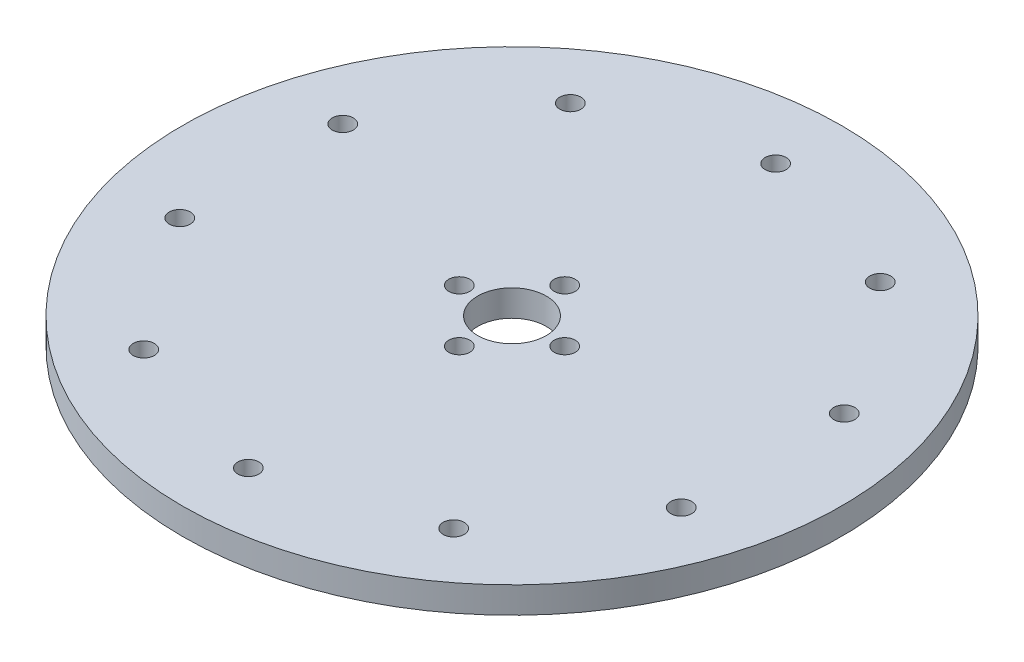
ISO-10303-21;
HEADER;
FILE_DESCRIPTION(('STEP AP214'),'2;1');
FILE_NAME('part.step','',(''),(''),'','','');
FILE_SCHEMA(('AUTOMOTIVE_DESIGN { 1 0 10303 214 1 1 1 1 }'));
ENDSEC;
DATA;
#1=APPLICATION_CONTEXT('core data for automotive mechanical design processes');
#2=APPLICATION_PROTOCOL_DEFINITION('international standard','automotive_design',2000,#1);
#3=PRODUCT_CONTEXT('',#1,'mechanical');
#4=PRODUCT('Part','Part','',(#3));
#5=PRODUCT_RELATED_PRODUCT_CATEGORY('part','',(#4));
#6=PRODUCT_DEFINITION_FORMATION('','',#4);
#7=PRODUCT_DEFINITION_CONTEXT('part definition',#1,'design');
#8=PRODUCT_DEFINITION('design','',#6,#7);
#9=PRODUCT_DEFINITION_SHAPE('','',#8);
#10=(LENGTH_UNIT() NAMED_UNIT(*) SI_UNIT(.MILLI.,.METRE.));
#11=(NAMED_UNIT(*) PLANE_ANGLE_UNIT() SI_UNIT($,.RADIAN.));
#12=(NAMED_UNIT(*) SI_UNIT($,.STERADIAN.) SOLID_ANGLE_UNIT());
#13=UNCERTAINTY_MEASURE_WITH_UNIT(LENGTH_MEASURE(1.E-05),#10,'distance_accuracy_value','');
#14=(GEOMETRIC_REPRESENTATION_CONTEXT(3) GLOBAL_UNCERTAINTY_ASSIGNED_CONTEXT((#13)) GLOBAL_UNIT_ASSIGNED_CONTEXT((#10,
#11,#12)) REPRESENTATION_CONTEXT('',''));
#15=CARTESIAN_POINT('',(0.,0.,0.));
#16=DIRECTION('',(0.,0.,1.));
#17=DIRECTION('',(1.,0.,0.));
#18=AXIS2_PLACEMENT_3D('',#15,#16,#17);
#19=CARTESIAN_POINT('',(0.,4.,0.));
#20=DIRECTION('',(0.,-1.,0.));
#21=DIRECTION('',(0.,0.,-1.));
#22=AXIS2_PLACEMENT_3D('',#19,#20,#21);
#23=CYLINDRICAL_SURFACE('',#22,50.);
#24=CARTESIAN_POINT('',(0.,4.,0.));
#25=DIRECTION('',(0.,1.,0.));
#26=DIRECTION('',(0.,0.,1.));
#27=AXIS2_PLACEMENT_3D('',#24,#25,#26);
#28=CIRCLE('',#27,50.);
#29=CARTESIAN_POINT('',(0.,4.,50.));
#30=VERTEX_POINT('',#29);
#31=EDGE_CURVE('E10',#30,#30,#28,.T.);
#32=ORIENTED_EDGE('',*,*,#31,.F.);
#33=EDGE_LOOP('',(#32));
#34=FACE_BOUND('',#33,.T.);
#35=CARTESIAN_POINT('',(0.,0.,0.));
#36=DIRECTION('',(0.,1.,0.));
#37=DIRECTION('',(0.,0.,1.));
#38=AXIS2_PLACEMENT_3D('',#35,#36,#37);
#39=CIRCLE('',#38,50.);
#40=CARTESIAN_POINT('',(0.,0.,50.));
#41=VERTEX_POINT('',#40);
#42=EDGE_CURVE('E42',#41,#41,#39,.T.);
#43=ORIENTED_EDGE('',*,*,#42,.T.);
#44=EDGE_LOOP('',(#43));
#45=FACE_BOUND('',#44,.T.);
#46=ADVANCED_FACE('F35',(#34,#45),#23,.T.);
#47=CARTESIAN_POINT('',(0.,4.,0.));
#48=DIRECTION('',(0.,1.,0.));
#49=DIRECTION('',(0.,0.,1.));
#50=AXIS2_PLACEMENT_3D('',#47,#48,#49);
#51=PLANE('',#50);
#52=CARTESIAN_POINT('',(-23.5114100916923,4.,-32.3606797749889));
#53=DIRECTION('',(0.,1.,0.));
#54=DIRECTION('',(0.,0.,1.));
#55=AXIS2_PLACEMENT_3D('',#52,#53,#54);
#56=CIRCLE('',#55,1.59999999999626);
#57=CARTESIAN_POINT('',(-23.5114100916923,4.,-30.7606797749927));
#58=VERTEX_POINT('',#57);
#59=EDGE_CURVE('E97',#58,#58,#56,.T.);
#60=ORIENTED_EDGE('',*,*,#59,.F.);
#61=EDGE_LOOP('',(#60));
#62=FACE_BOUND('',#61,.T.);
#63=CARTESIAN_POINT('',(-38.0422606518062,4.,-12.3606797749979));
#64=DIRECTION('',(0.,1.,0.));
#65=DIRECTION('',(0.,0.,1.));
#66=AXIS2_PLACEMENT_3D('',#63,#64,#65);
#67=CIRCLE('',#66,1.6);
#68=CARTESIAN_POINT('',(-38.0422606518062,4.,-10.7606797749979));
#69=VERTEX_POINT('',#68);
#70=EDGE_CURVE('E87',#69,#69,#67,.T.);
#71=ORIENTED_EDGE('',*,*,#70,.F.);
#72=EDGE_LOOP('',(#71));
#73=FACE_BOUND('',#72,.T.);
#74=CARTESIAN_POINT('',(-38.0422606518062,4.,12.3606797749979));
#75=DIRECTION('',(0.,1.,0.));
#76=DIRECTION('',(0.,0.,1.));
#77=AXIS2_PLACEMENT_3D('',#74,#75,#76);
#78=CIRCLE('',#77,1.6);
#79=CARTESIAN_POINT('',(-38.0422606518062,4.,13.9606797749979));
#80=VERTEX_POINT('',#79);
#81=EDGE_CURVE('E84',#80,#80,#78,.T.);
#82=ORIENTED_EDGE('',*,*,#81,.F.);
#83=EDGE_LOOP('',(#82));
#84=FACE_BOUND('',#83,.T.);
#85=CARTESIAN_POINT('',(-23.5114100916989,4.,32.3606797749979));
#86=DIRECTION('',(0.,1.,0.));
#87=DIRECTION('',(0.,0.,1.));
#88=AXIS2_PLACEMENT_3D('',#85,#86,#87);
#89=CIRCLE('',#88,1.6);
#90=CARTESIAN_POINT('',(-23.5114100916989,4.,33.9606797749979));
#91=VERTEX_POINT('',#90);
#92=EDGE_CURVE('E81',#91,#91,#89,.T.);
#93=ORIENTED_EDGE('',*,*,#92,.F.);
#94=EDGE_LOOP('',(#93));
#95=FACE_BOUND('',#94,.T.);
#96=CARTESIAN_POINT('',(0.,4.,40.));
#97=DIRECTION('',(0.,1.,0.));
#98=DIRECTION('',(0.,0.,1.));
#99=AXIS2_PLACEMENT_3D('',#96,#97,#98);
#100=CIRCLE('',#99,1.6);
#101=CARTESIAN_POINT('',(0.,4.,41.6));
#102=VERTEX_POINT('',#101);
#103=EDGE_CURVE('E77',#102,#102,#100,.T.);
#104=ORIENTED_EDGE('',*,*,#103,.F.);
#105=EDGE_LOOP('',(#104));
#106=FACE_BOUND('',#105,.T.);
#107=CARTESIAN_POINT('',(23.511410091699,4.,32.3606797749979));
#108=DIRECTION('',(0.,1.,0.));
#109=DIRECTION('',(0.,0.,1.));
#110=AXIS2_PLACEMENT_3D('',#107,#108,#109);
#111=CIRCLE('',#110,1.6);
#112=CARTESIAN_POINT('',(23.511410091699,4.,33.9606797749979));
#113=VERTEX_POINT('',#112);
#114=EDGE_CURVE('E73',#113,#113,#111,.T.);
#115=ORIENTED_EDGE('',*,*,#114,.F.);
#116=EDGE_LOOP('',(#115));
#117=FACE_BOUND('',#116,.T.);
#118=CARTESIAN_POINT('',(38.0422606518062,4.,12.3606797749979));
#119=DIRECTION('',(0.,1.,0.));
#120=DIRECTION('',(0.,0.,1.));
#121=AXIS2_PLACEMENT_3D('',#118,#119,#120);
#122=CIRCLE('',#121,1.6);
#123=CARTESIAN_POINT('',(38.0422606518062,4.,13.9606797749979));
#124=VERTEX_POINT('',#123);
#125=EDGE_CURVE('E69',#124,#124,#122,.T.);
#126=ORIENTED_EDGE('',*,*,#125,.F.);
#127=EDGE_LOOP('',(#126));
#128=FACE_BOUND('',#127,.T.);
#129=CARTESIAN_POINT('',(23.511410091699,4.,-32.3606797749979));
#130=DIRECTION('',(0.,1.,0.));
#131=DIRECTION('',(0.,0.,1.));
#132=AXIS2_PLACEMENT_3D('',#129,#130,#131);
#133=CIRCLE('',#132,1.6);
#134=CARTESIAN_POINT('',(23.511410091699,4.,-30.7606797749979));
#135=VERTEX_POINT('',#134);
#136=EDGE_CURVE('E65',#135,#135,#133,.T.);
#137=ORIENTED_EDGE('',*,*,#136,.F.);
#138=EDGE_LOOP('',(#137));
#139=FACE_BOUND('',#138,.T.);
#140=CARTESIAN_POINT('',(38.0422606518062,4.,-12.3606797749979));
#141=DIRECTION('',(0.,1.,0.));
#142=DIRECTION('',(0.,0.,1.));
#143=AXIS2_PLACEMENT_3D('',#140,#141,#142);
#144=CIRCLE('',#143,1.6);
#145=CARTESIAN_POINT('',(38.0422606518062,4.,-10.7606797749979));
#146=VERTEX_POINT('',#145);
#147=EDGE_CURVE('E61',#146,#146,#144,.T.);
#148=ORIENTED_EDGE('',*,*,#147,.F.);
#149=EDGE_LOOP('',(#148));
#150=FACE_BOUND('',#149,.T.);
#151=CARTESIAN_POINT('',(0.,4.,-40.));
#152=DIRECTION('',(0.,1.,0.));
#153=DIRECTION('',(0.,0.,1.));
#154=AXIS2_PLACEMENT_3D('',#151,#152,#153);
#155=CIRCLE('',#154,1.6);
#156=CARTESIAN_POINT('',(0.,4.,-38.4));
#157=VERTEX_POINT('',#156);
#158=EDGE_CURVE('E57',#157,#157,#155,.T.);
#159=ORIENTED_EDGE('',*,*,#158,.F.);
#160=EDGE_LOOP('',(#159));
#161=FACE_BOUND('',#160,.T.);
#162=CARTESIAN_POINT('',(0.,4.,0.));
#163=DIRECTION('',(0.,1.,0.));
#164=DIRECTION('',(0.,0.,1.));
#165=AXIS2_PLACEMENT_3D('',#162,#163,#164);
#166=CIRCLE('',#165,5.2);
#167=CARTESIAN_POINT('',(0.,4.,5.2));
#168=VERTEX_POINT('',#167);
#169=EDGE_CURVE('E56',#168,#168,#166,.T.);
#170=ORIENTED_EDGE('',*,*,#169,.F.);
#171=EDGE_LOOP('',(#170));
#172=FACE_BOUND('',#171,.T.);
#173=CARTESIAN_POINT('',(0.,4.,8.));
#174=DIRECTION('',(0.,1.,0.));
#175=DIRECTION('',(0.,0.,1.));
#176=AXIS2_PLACEMENT_3D('',#173,#174,#175);
#177=CIRCLE('',#176,1.6);
#178=CARTESIAN_POINT('',(0.,4.,9.6));
#179=VERTEX_POINT('',#178);
#180=EDGE_CURVE('E117',#179,#179,#177,.T.);
#181=ORIENTED_EDGE('',*,*,#180,.F.);
#182=EDGE_LOOP('',(#181));
#183=FACE_BOUND('',#182,.T.);
#184=CARTESIAN_POINT('',(8.,4.,0.));
#185=DIRECTION('',(0.,1.,0.));
#186=DIRECTION('',(0.,0.,1.));
#187=AXIS2_PLACEMENT_3D('',#184,#185,#186);
#188=CIRCLE('',#187,1.6);
#189=CARTESIAN_POINT('',(8.,4.,1.6));
#190=VERTEX_POINT('',#189);
#191=EDGE_CURVE('E123',#190,#190,#188,.T.);
#192=ORIENTED_EDGE('',*,*,#191,.F.);
#193=EDGE_LOOP('',(#192));
#194=FACE_BOUND('',#193,.T.);
#195=CARTESIAN_POINT('',(0.,4.,-8.));
#196=DIRECTION('',(0.,1.,0.));
#197=DIRECTION('',(0.,0.,1.));
#198=AXIS2_PLACEMENT_3D('',#195,#196,#197);
#199=CIRCLE('',#198,1.6);
#200=CARTESIAN_POINT('',(0.,4.,-6.4));
#201=VERTEX_POINT('',#200);
#202=EDGE_CURVE('E129',#201,#201,#199,.T.);
#203=ORIENTED_EDGE('',*,*,#202,.F.);
#204=EDGE_LOOP('',(#203));
#205=FACE_BOUND('',#204,.T.);
#206=CARTESIAN_POINT('',(-8.,4.,0.));
#207=DIRECTION('',(0.,1.,0.));
#208=DIRECTION('',(0.,0.,1.));
#209=AXIS2_PLACEMENT_3D('',#206,#207,#208);
#210=CIRCLE('',#209,1.6);
#211=CARTESIAN_POINT('',(-8.,4.,1.6));
#212=VERTEX_POINT('',#211);
#213=EDGE_CURVE('E50',#212,#212,#210,.T.);
#214=ORIENTED_EDGE('',*,*,#213,.F.);
#215=EDGE_LOOP('',(#214));
#216=FACE_BOUND('',#215,.T.);
#217=ORIENTED_EDGE('',*,*,#31,.T.);
#218=EDGE_LOOP('',(#217));
#219=FACE_BOUND('',#218,.T.);
#220=ADVANCED_FACE('F144',(#62,#73,#84,#95,#106,#117,#128,#139,#150,#161,#172,#183,#194,#205,
#216,#219),#51,.T.);
#221=CARTESIAN_POINT('',(0.,0.,0.));
#222=DIRECTION('',(0.,1.,0.));
#223=DIRECTION('',(0.,0.,1.));
#224=AXIS2_PLACEMENT_3D('',#221,#222,#223);
#225=PLANE('',#224);
#226=CARTESIAN_POINT('',(-23.5114100916923,0.,-32.3606797749889));
#227=DIRECTION('',(0.,1.,0.));
#228=DIRECTION('',(0.,0.,1.));
#229=AXIS2_PLACEMENT_3D('',#226,#227,#228);
#230=CIRCLE('',#229,1.59999999999626);
#231=CARTESIAN_POINT('',(-23.5114100916923,0.,-30.7606797749927));
#232=VERTEX_POINT('',#231);
#233=EDGE_CURVE('E38',#232,#232,#230,.T.);
#234=ORIENTED_EDGE('',*,*,#233,.T.);
#235=EDGE_LOOP('',(#234));
#236=FACE_BOUND('',#235,.T.);
#237=CARTESIAN_POINT('',(-38.0422606518062,0.,-12.3606797749979));
#238=DIRECTION('',(0.,1.,0.));
#239=DIRECTION('',(0.,0.,1.));
#240=AXIS2_PLACEMENT_3D('',#237,#238,#239);
#241=CIRCLE('',#240,1.6);
#242=CARTESIAN_POINT('',(-38.0422606518062,0.,-10.7606797749979));
#243=VERTEX_POINT('',#242);
#244=EDGE_CURVE('E85',#243,#243,#241,.T.);
#245=ORIENTED_EDGE('',*,*,#244,.T.);
#246=EDGE_LOOP('',(#245));
#247=FACE_BOUND('',#246,.T.);
#248=CARTESIAN_POINT('',(-38.0422606518062,0.,12.3606797749979));
#249=DIRECTION('',(0.,1.,0.));
#250=DIRECTION('',(0.,0.,1.));
#251=AXIS2_PLACEMENT_3D('',#248,#249,#250);
#252=CIRCLE('',#251,1.6);
#253=CARTESIAN_POINT('',(-38.0422606518062,0.,13.9606797749979));
#254=VERTEX_POINT('',#253);
#255=EDGE_CURVE('E82',#254,#254,#252,.T.);
#256=ORIENTED_EDGE('',*,*,#255,.T.);
#257=EDGE_LOOP('',(#256));
#258=FACE_BOUND('',#257,.T.);
#259=CARTESIAN_POINT('',(-23.5114100916989,0.,32.3606797749979));
#260=DIRECTION('',(0.,1.,0.));
#261=DIRECTION('',(0.,0.,1.));
#262=AXIS2_PLACEMENT_3D('',#259,#260,#261);
#263=CIRCLE('',#262,1.6);
#264=CARTESIAN_POINT('',(-23.5114100916989,0.,33.9606797749979));
#265=VERTEX_POINT('',#264);
#266=EDGE_CURVE('E78',#265,#265,#263,.T.);
#267=ORIENTED_EDGE('',*,*,#266,.T.);
#268=EDGE_LOOP('',(#267));
#269=FACE_BOUND('',#268,.T.);
#270=CARTESIAN_POINT('',(0.,0.,40.));
#271=DIRECTION('',(0.,1.,0.));
#272=DIRECTION('',(0.,0.,1.));
#273=AXIS2_PLACEMENT_3D('',#270,#271,#272);
#274=CIRCLE('',#273,1.6);
#275=CARTESIAN_POINT('',(0.,0.,41.6));
#276=VERTEX_POINT('',#275);
#277=EDGE_CURVE('E74',#276,#276,#274,.T.);
#278=ORIENTED_EDGE('',*,*,#277,.T.);
#279=EDGE_LOOP('',(#278));
#280=FACE_BOUND('',#279,.T.);
#281=CARTESIAN_POINT('',(23.511410091699,0.,32.3606797749979));
#282=DIRECTION('',(0.,1.,0.));
#283=DIRECTION('',(0.,0.,1.));
#284=AXIS2_PLACEMENT_3D('',#281,#282,#283);
#285=CIRCLE('',#284,1.6);
#286=CARTESIAN_POINT('',(23.511410091699,0.,33.9606797749979));
#287=VERTEX_POINT('',#286);
#288=EDGE_CURVE('E70',#287,#287,#285,.T.);
#289=ORIENTED_EDGE('',*,*,#288,.T.);
#290=EDGE_LOOP('',(#289));
#291=FACE_BOUND('',#290,.T.);
#292=CARTESIAN_POINT('',(38.0422606518062,0.,12.3606797749979));
#293=DIRECTION('',(0.,1.,0.));
#294=DIRECTION('',(0.,0.,1.));
#295=AXIS2_PLACEMENT_3D('',#292,#293,#294);
#296=CIRCLE('',#295,1.6);
#297=CARTESIAN_POINT('',(38.0422606518062,0.,13.9606797749979));
#298=VERTEX_POINT('',#297);
#299=EDGE_CURVE('E66',#298,#298,#296,.T.);
#300=ORIENTED_EDGE('',*,*,#299,.T.);
#301=EDGE_LOOP('',(#300));
#302=FACE_BOUND('',#301,.T.);
#303=CARTESIAN_POINT('',(23.511410091699,0.,-32.3606797749979));
#304=DIRECTION('',(0.,1.,0.));
#305=DIRECTION('',(0.,0.,1.));
#306=AXIS2_PLACEMENT_3D('',#303,#304,#305);
#307=CIRCLE('',#306,1.6);
#308=CARTESIAN_POINT('',(23.511410091699,0.,-30.7606797749979));
#309=VERTEX_POINT('',#308);
#310=EDGE_CURVE('E62',#309,#309,#307,.T.);
#311=ORIENTED_EDGE('',*,*,#310,.T.);
#312=EDGE_LOOP('',(#311));
#313=FACE_BOUND('',#312,.T.);
#314=CARTESIAN_POINT('',(38.0422606518062,0.,-12.3606797749979));
#315=DIRECTION('',(0.,1.,0.));
#316=DIRECTION('',(0.,0.,1.));
#317=AXIS2_PLACEMENT_3D('',#314,#315,#316);
#318=CIRCLE('',#317,1.6);
#319=CARTESIAN_POINT('',(38.0422606518062,0.,-10.7606797749979));
#320=VERTEX_POINT('',#319);
#321=EDGE_CURVE('E58',#320,#320,#318,.T.);
#322=ORIENTED_EDGE('',*,*,#321,.T.);
#323=EDGE_LOOP('',(#322));
#324=FACE_BOUND('',#323,.T.);
#325=CARTESIAN_POINT('',(0.,0.,-40.));
#326=DIRECTION('',(0.,1.,0.));
#327=DIRECTION('',(0.,0.,1.));
#328=AXIS2_PLACEMENT_3D('',#325,#326,#327);
#329=CIRCLE('',#328,1.6);
#330=CARTESIAN_POINT('',(0.,0.,-38.4));
#331=VERTEX_POINT('',#330);
#332=EDGE_CURVE('E53',#331,#331,#329,.T.);
#333=ORIENTED_EDGE('',*,*,#332,.T.);
#334=EDGE_LOOP('',(#333));
#335=FACE_BOUND('',#334,.T.);
#336=CARTESIAN_POINT('',(0.,0.,0.));
#337=DIRECTION('',(0.,1.,0.));
#338=DIRECTION('',(0.,0.,1.));
#339=AXIS2_PLACEMENT_3D('',#336,#337,#338);
#340=CIRCLE('',#339,5.2);
#341=CARTESIAN_POINT('',(0.,0.,5.2));
#342=VERTEX_POINT('',#341);
#343=EDGE_CURVE('E114',#342,#342,#340,.T.);
#344=ORIENTED_EDGE('',*,*,#343,.T.);
#345=EDGE_LOOP('',(#344));
#346=FACE_BOUND('',#345,.T.);
#347=CARTESIAN_POINT('',(0.,0.,8.));
#348=DIRECTION('',(0.,1.,0.));
#349=DIRECTION('',(0.,0.,1.));
#350=AXIS2_PLACEMENT_3D('',#347,#348,#349);
#351=CIRCLE('',#350,1.6);
#352=CARTESIAN_POINT('',(0.,0.,9.6));
#353=VERTEX_POINT('',#352);
#354=EDGE_CURVE('E120',#353,#353,#351,.T.);
#355=ORIENTED_EDGE('',*,*,#354,.T.);
#356=EDGE_LOOP('',(#355));
#357=FACE_BOUND('',#356,.T.);
#358=CARTESIAN_POINT('',(8.,0.,0.));
#359=DIRECTION('',(0.,1.,0.));
#360=DIRECTION('',(0.,0.,1.));
#361=AXIS2_PLACEMENT_3D('',#358,#359,#360);
#362=CIRCLE('',#361,1.6);
#363=CARTESIAN_POINT('',(8.,0.,1.6));
#364=VERTEX_POINT('',#363);
#365=EDGE_CURVE('E126',#364,#364,#362,.T.);
#366=ORIENTED_EDGE('',*,*,#365,.T.);
#367=EDGE_LOOP('',(#366));
#368=FACE_BOUND('',#367,.T.);
#369=CARTESIAN_POINT('',(0.,0.,-8.));
#370=DIRECTION('',(0.,1.,0.));
#371=DIRECTION('',(0.,0.,1.));
#372=AXIS2_PLACEMENT_3D('',#369,#370,#371);
#373=CIRCLE('',#372,1.6);
#374=CARTESIAN_POINT('',(0.,0.,-6.4));
#375=VERTEX_POINT('',#374);
#376=EDGE_CURVE('E132',#375,#375,#373,.T.);
#377=ORIENTED_EDGE('',*,*,#376,.T.);
#378=EDGE_LOOP('',(#377));
#379=FACE_BOUND('',#378,.T.);
#380=CARTESIAN_POINT('',(-8.,0.,0.));
#381=DIRECTION('',(0.,1.,0.));
#382=DIRECTION('',(0.,0.,1.));
#383=AXIS2_PLACEMENT_3D('',#380,#381,#382);
#384=CIRCLE('',#383,1.6);
#385=CARTESIAN_POINT('',(-8.,0.,1.6));
#386=VERTEX_POINT('',#385);
#387=EDGE_CURVE('E47',#386,#386,#384,.T.);
#388=ORIENTED_EDGE('',*,*,#387,.T.);
#389=EDGE_LOOP('',(#388));
#390=FACE_BOUND('',#389,.T.);
#391=ORIENTED_EDGE('',*,*,#42,.F.);
#392=EDGE_LOOP('',(#391));
#393=FACE_BOUND('',#392,.T.);
#394=ADVANCED_FACE('F146',(#236,#247,#258,#269,#280,#291,#302,#313,#324,#335,#346,#357,#368,
#379,#390,#393),#225,.F.);
#395=CARTESIAN_POINT('',(-8.,0.,0.));
#396=DIRECTION('',(0.,1.,0.));
#397=DIRECTION('',(0.,0.,1.));
#398=AXIS2_PLACEMENT_3D('',#395,#396,#397);
#399=CYLINDRICAL_SURFACE('',#398,1.6);
#400=ORIENTED_EDGE('',*,*,#387,.F.);
#401=EDGE_LOOP('',(#400));
#402=FACE_BOUND('',#401,.T.);
#403=ORIENTED_EDGE('',*,*,#213,.T.);
#404=EDGE_LOOP('',(#403));
#405=FACE_BOUND('',#404,.T.);
#406=ADVANCED_FACE('F142',(#402,#405),#399,.F.);
#407=CARTESIAN_POINT('',(0.,0.,-8.));
#408=DIRECTION('',(0.,1.,0.));
#409=DIRECTION('',(0.,0.,1.));
#410=AXIS2_PLACEMENT_3D('',#407,#408,#409);
#411=CYLINDRICAL_SURFACE('',#410,1.6);
#412=ORIENTED_EDGE('',*,*,#376,.F.);
#413=EDGE_LOOP('',(#412));
#414=FACE_BOUND('',#413,.T.);
#415=ORIENTED_EDGE('',*,*,#202,.T.);
#416=EDGE_LOOP('',(#415));
#417=FACE_BOUND('',#416,.T.);
#418=ADVANCED_FACE('F160',(#414,#417),#411,.F.);
#419=CARTESIAN_POINT('',(8.,0.,0.));
#420=DIRECTION('',(0.,1.,0.));
#421=DIRECTION('',(0.,0.,1.));
#422=AXIS2_PLACEMENT_3D('',#419,#420,#421);
#423=CYLINDRICAL_SURFACE('',#422,1.6);
#424=ORIENTED_EDGE('',*,*,#365,.F.);
#425=EDGE_LOOP('',(#424));
#426=FACE_BOUND('',#425,.T.);
#427=ORIENTED_EDGE('',*,*,#191,.T.);
#428=EDGE_LOOP('',(#427));
#429=FACE_BOUND('',#428,.T.);
#430=ADVANCED_FACE('F164',(#426,#429),#423,.F.);
#431=CARTESIAN_POINT('',(0.,0.,8.));
#432=DIRECTION('',(0.,1.,0.));
#433=DIRECTION('',(0.,0.,1.));
#434=AXIS2_PLACEMENT_3D('',#431,#432,#433);
#435=CYLINDRICAL_SURFACE('',#434,1.6);
#436=ORIENTED_EDGE('',*,*,#354,.F.);
#437=EDGE_LOOP('',(#436));
#438=FACE_BOUND('',#437,.T.);
#439=ORIENTED_EDGE('',*,*,#180,.T.);
#440=EDGE_LOOP('',(#439));
#441=FACE_BOUND('',#440,.T.);
#442=ADVANCED_FACE('F168',(#438,#441),#435,.F.);
#443=CARTESIAN_POINT('',(0.,0.,0.));
#444=DIRECTION('',(0.,1.,0.));
#445=DIRECTION('',(0.,0.,1.));
#446=AXIS2_PLACEMENT_3D('',#443,#444,#445);
#447=CYLINDRICAL_SURFACE('',#446,5.2);
#448=ORIENTED_EDGE('',*,*,#343,.F.);
#449=EDGE_LOOP('',(#448));
#450=FACE_BOUND('',#449,.T.);
#451=ORIENTED_EDGE('',*,*,#169,.T.);
#452=EDGE_LOOP('',(#451));
#453=FACE_BOUND('',#452,.T.);
#454=ADVANCED_FACE('F172',(#450,#453),#447,.F.);
#455=CARTESIAN_POINT('',(0.,-6.,-40.));
#456=DIRECTION('',(0.,1.,0.));
#457=DIRECTION('',(0.,0.,1.));
#458=AXIS2_PLACEMENT_3D('',#455,#456,#457);
#459=CYLINDRICAL_SURFACE('',#458,1.6);
#460=ORIENTED_EDGE('',*,*,#158,.T.);
#461=EDGE_LOOP('',(#460));
#462=FACE_BOUND('',#461,.T.);
#463=ORIENTED_EDGE('',*,*,#332,.F.);
#464=EDGE_LOOP('',(#463));
#465=FACE_BOUND('',#464,.T.);
#466=ADVANCED_FACE('F176',(#462,#465),#459,.F.);
#467=CARTESIAN_POINT('',(38.0422606518062,-6.,-12.3606797749979));
#468=DIRECTION('',(0.,1.,0.));
#469=DIRECTION('',(0.,0.,1.));
#470=AXIS2_PLACEMENT_3D('',#467,#468,#469);
#471=CYLINDRICAL_SURFACE('',#470,1.6);
#472=ORIENTED_EDGE('',*,*,#147,.T.);
#473=EDGE_LOOP('',(#472));
#474=FACE_BOUND('',#473,.T.);
#475=ORIENTED_EDGE('',*,*,#321,.F.);
#476=EDGE_LOOP('',(#475));
#477=FACE_BOUND('',#476,.T.);
#478=ADVANCED_FACE('F180',(#474,#477),#471,.F.);
#479=CARTESIAN_POINT('',(23.511410091699,-6.,-32.3606797749979));
#480=DIRECTION('',(0.,1.,0.));
#481=DIRECTION('',(0.,0.,1.));
#482=AXIS2_PLACEMENT_3D('',#479,#480,#481);
#483=CYLINDRICAL_SURFACE('',#482,1.6);
#484=ORIENTED_EDGE('',*,*,#136,.T.);
#485=EDGE_LOOP('',(#484));
#486=FACE_BOUND('',#485,.T.);
#487=ORIENTED_EDGE('',*,*,#310,.F.);
#488=EDGE_LOOP('',(#487));
#489=FACE_BOUND('',#488,.T.);
#490=ADVANCED_FACE('F184',(#486,#489),#483,.F.);
#491=CARTESIAN_POINT('',(38.0422606518062,-6.,12.3606797749979));
#492=DIRECTION('',(0.,1.,0.));
#493=DIRECTION('',(0.,0.,1.));
#494=AXIS2_PLACEMENT_3D('',#491,#492,#493);
#495=CYLINDRICAL_SURFACE('',#494,1.6);
#496=ORIENTED_EDGE('',*,*,#125,.T.);
#497=EDGE_LOOP('',(#496));
#498=FACE_BOUND('',#497,.T.);
#499=ORIENTED_EDGE('',*,*,#299,.F.);
#500=EDGE_LOOP('',(#499));
#501=FACE_BOUND('',#500,.T.);
#502=ADVANCED_FACE('F188',(#498,#501),#495,.F.);
#503=CARTESIAN_POINT('',(23.511410091699,-6.,32.3606797749979));
#504=DIRECTION('',(0.,1.,0.));
#505=DIRECTION('',(0.,0.,1.));
#506=AXIS2_PLACEMENT_3D('',#503,#504,#505);
#507=CYLINDRICAL_SURFACE('',#506,1.6);
#508=ORIENTED_EDGE('',*,*,#114,.T.);
#509=EDGE_LOOP('',(#508));
#510=FACE_BOUND('',#509,.T.);
#511=ORIENTED_EDGE('',*,*,#288,.F.);
#512=EDGE_LOOP('',(#511));
#513=FACE_BOUND('',#512,.T.);
#514=ADVANCED_FACE('F192',(#510,#513),#507,.F.);
#515=CARTESIAN_POINT('',(0.,-6.,40.));
#516=DIRECTION('',(0.,1.,0.));
#517=DIRECTION('',(0.,0.,1.));
#518=AXIS2_PLACEMENT_3D('',#515,#516,#517);
#519=CYLINDRICAL_SURFACE('',#518,1.6);
#520=ORIENTED_EDGE('',*,*,#103,.T.);
#521=EDGE_LOOP('',(#520));
#522=FACE_BOUND('',#521,.T.);
#523=ORIENTED_EDGE('',*,*,#277,.F.);
#524=EDGE_LOOP('',(#523));
#525=FACE_BOUND('',#524,.T.);
#526=ADVANCED_FACE('F196',(#522,#525),#519,.F.);
#527=CARTESIAN_POINT('',(-23.5114100916989,-6.,32.3606797749979));
#528=DIRECTION('',(0.,1.,0.));
#529=DIRECTION('',(0.,0.,1.));
#530=AXIS2_PLACEMENT_3D('',#527,#528,#529);
#531=CYLINDRICAL_SURFACE('',#530,1.6);
#532=ORIENTED_EDGE('',*,*,#92,.T.);
#533=EDGE_LOOP('',(#532));
#534=FACE_BOUND('',#533,.T.);
#535=ORIENTED_EDGE('',*,*,#266,.F.);
#536=EDGE_LOOP('',(#535));
#537=FACE_BOUND('',#536,.T.);
#538=ADVANCED_FACE('F200',(#534,#537),#531,.F.);
#539=CARTESIAN_POINT('',(-38.0422606518062,-6.,12.3606797749979));
#540=DIRECTION('',(0.,1.,0.));
#541=DIRECTION('',(0.,0.,1.));
#542=AXIS2_PLACEMENT_3D('',#539,#540,#541);
#543=CYLINDRICAL_SURFACE('',#542,1.6);
#544=ORIENTED_EDGE('',*,*,#81,.T.);
#545=EDGE_LOOP('',(#544));
#546=FACE_BOUND('',#545,.T.);
#547=ORIENTED_EDGE('',*,*,#255,.F.);
#548=EDGE_LOOP('',(#547));
#549=FACE_BOUND('',#548,.T.);
#550=ADVANCED_FACE('F204',(#546,#549),#543,.F.);
#551=CARTESIAN_POINT('',(-38.0422606518062,-6.,-12.3606797749979));
#552=DIRECTION('',(0.,1.,0.));
#553=DIRECTION('',(0.,0.,1.));
#554=AXIS2_PLACEMENT_3D('',#551,#552,#553);
#555=CYLINDRICAL_SURFACE('',#554,1.6);
#556=ORIENTED_EDGE('',*,*,#70,.T.);
#557=EDGE_LOOP('',(#556));
#558=FACE_BOUND('',#557,.T.);
#559=ORIENTED_EDGE('',*,*,#244,.F.);
#560=EDGE_LOOP('',(#559));
#561=FACE_BOUND('',#560,.T.);
#562=ADVANCED_FACE('F208',(#558,#561),#555,.F.);
#563=CARTESIAN_POINT('',(-23.5114100916923,-6.,-32.3606797749889));
#564=DIRECTION('',(0.,1.,0.));
#565=DIRECTION('',(0.,0.,1.));
#566=AXIS2_PLACEMENT_3D('',#563,#564,#565);
#567=CYLINDRICAL_SURFACE('',#566,1.59999999999626);
#568=ORIENTED_EDGE('',*,*,#59,.T.);
#569=EDGE_LOOP('',(#568));
#570=FACE_BOUND('',#569,.T.);
#571=ORIENTED_EDGE('',*,*,#233,.F.);
#572=EDGE_LOOP('',(#571));
#573=FACE_BOUND('',#572,.T.);
#574=ADVANCED_FACE('F212',(#570,#573),#567,.F.);
#575=CLOSED_SHELL('',(#46,#220,#394,#406,#418,#430,#442,#454,#466,#478,#490,#502,#514,#526,#538,
#550,#562,#574));
#576=MANIFOLD_SOLID_BREP('B2',#575);
#577=ADVANCED_BREP_SHAPE_REPRESENTATION('',(#18,#576),#14);
#578=SHAPE_DEFINITION_REPRESENTATION(#9,#577);
ENDSEC;
END-ISO-10303-21;
